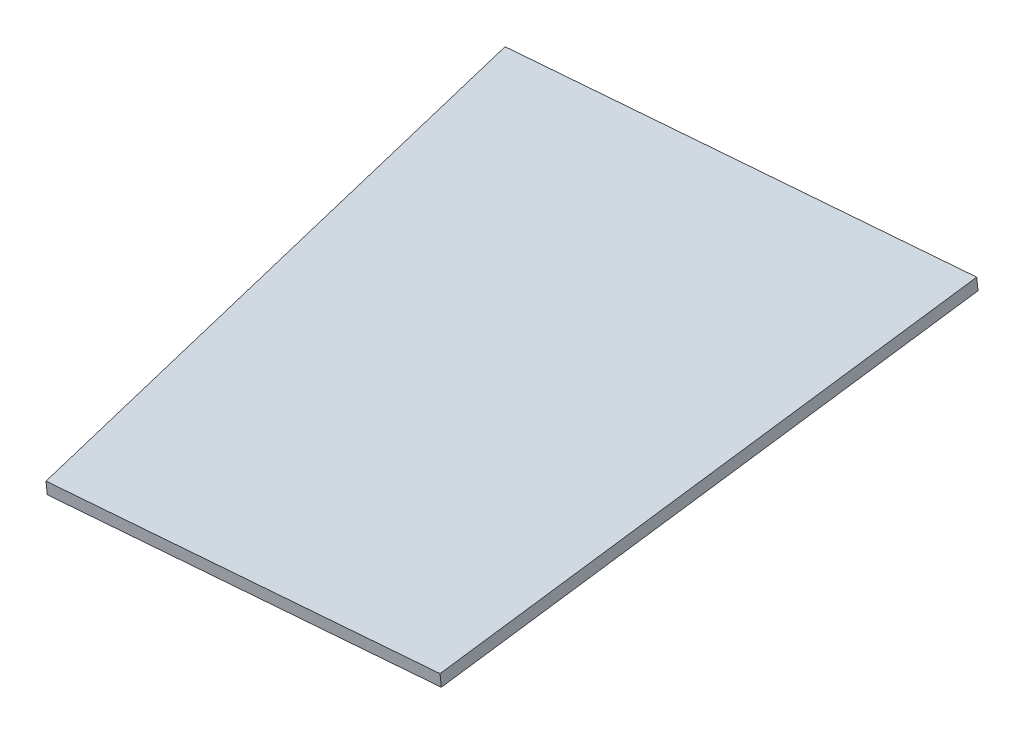
ISO-10303-21;
HEADER;
FILE_DESCRIPTION(('STEP AP214'),'2;1');
FILE_NAME('part.step','',(''),(''),'','','');
FILE_SCHEMA(('AUTOMOTIVE_DESIGN { 1 0 10303 214 1 1 1 1 }'));
ENDSEC;
DATA;
#1=APPLICATION_CONTEXT('core data for automotive mechanical design processes');
#2=APPLICATION_PROTOCOL_DEFINITION('international standard','automotive_design',2000,#1);
#3=PRODUCT_CONTEXT('',#1,'mechanical');
#4=PRODUCT('Part','Part','',(#3));
#5=PRODUCT_RELATED_PRODUCT_CATEGORY('part','',(#4));
#6=PRODUCT_DEFINITION_FORMATION('','',#4);
#7=PRODUCT_DEFINITION_CONTEXT('part definition',#1,'design');
#8=PRODUCT_DEFINITION('design','',#6,#7);
#9=PRODUCT_DEFINITION_SHAPE('','',#8);
#10=(LENGTH_UNIT() NAMED_UNIT(*) SI_UNIT(.MILLI.,.METRE.));
#11=(NAMED_UNIT(*) PLANE_ANGLE_UNIT() SI_UNIT($,.RADIAN.));
#12=(NAMED_UNIT(*) SI_UNIT($,.STERADIAN.) SOLID_ANGLE_UNIT());
#13=UNCERTAINTY_MEASURE_WITH_UNIT(LENGTH_MEASURE(1.E-05),#10,'distance_accuracy_value','');
#14=(GEOMETRIC_REPRESENTATION_CONTEXT(3) GLOBAL_UNCERTAINTY_ASSIGNED_CONTEXT((#13)) GLOBAL_UNIT_ASSIGNED_CONTEXT((#10,
#11,#12)) REPRESENTATION_CONTEXT('',''));
#15=CARTESIAN_POINT('',(0.,0.,0.));
#16=DIRECTION('',(0.,0.,1.));
#17=DIRECTION('',(1.,0.,0.));
#18=AXIS2_PLACEMENT_3D('',#15,#16,#17);
#19=CARTESIAN_POINT('',(-1170.3014032278,132.494811696863,1716.91639450697));
#20=DIRECTION('',(0.988506523153579,0.00360220731095837,-0.151135296292136));
#21=DIRECTION('',(-0.151136276859737,0.,-0.988512936595661));
#22=AXIS2_PLACEMENT_3D('',#19,#20,#21);
#23=PLANE('',#22);
#24=DIRECTION('',(-0.150542908587247,0.115009920737583,-0.981890803911528));
#25=VECTOR('',#24,1.);
#26=CARTESIAN_POINT('',(-1170.12557065827,145.110455906533,1718.36711987123));
#27=LINE('',#26,#25);
#28=CARTESIAN_POINT('',(-1170.12557065827,145.110455906533,1718.36711987123));
#29=VERTEX_POINT('',#28);
#30=CARTESIAN_POINT('',(-1253.07894845788,208.484157764556,1177.31766374471));
#31=VERTEX_POINT('',#30);
#32=EDGE_CURVE('E106',#29,#31,#27,.T.);
#33=ORIENTED_EDGE('',*,*,#32,.T.);
#34=DIRECTION('',(0.0138450842147968,0.993357811785071,0.114230343642402));
#35=VECTOR('',#34,1.);
#36=CARTESIAN_POINT('',(-1253.25478102741,195.868513554886,1175.86693838045));
#37=LINE('',#36,#35);
#38=CARTESIAN_POINT('',(-1253.25478102741,195.868513554886,1175.86693838045));
#39=VERTEX_POINT('',#38);
#40=EDGE_CURVE('E11',#39,#31,#37,.T.);
#41=ORIENTED_EDGE('',*,*,#40,.F.);
#42=DIRECTION('',(-0.150542908587247,0.115009920737583,-0.981890803911528));
#43=VECTOR('',#42,1.);
#44=CARTESIAN_POINT('',(-1170.3014032278,132.494811696863,1716.91639450697));
#45=LINE('',#44,#43);
#46=CARTESIAN_POINT('',(-1170.3014032278,132.494811696863,1716.91639450697));
#47=VERTEX_POINT('',#46);
#48=EDGE_CURVE('E94',#47,#39,#45,.T.);
#49=ORIENTED_EDGE('',*,*,#48,.F.);
#50=DIRECTION('',(0.0138450842147968,0.993357811785071,0.114230343642402));
#51=VECTOR('',#50,1.);
#52=CARTESIAN_POINT('',(-1170.3014032278,132.494811696863,1716.91639450697));
#53=LINE('',#52,#51);
#54=EDGE_CURVE('E102',#47,#29,#53,.T.);
#55=ORIENTED_EDGE('',*,*,#54,.T.);
#56=EDGE_LOOP('',(#33,#41,#49,#55));
#57=FACE_BOUND('',#56,.T.);
#58=ADVANCED_FACE('F43',(#57),#23,.F.);
#59=CARTESIAN_POINT('',(-1253.25478102741,195.868513554886,1175.86693838045));
#60=DIRECTION('',(0.0861413324994515,-0.115001508074473,0.989623324288497));
#61=DIRECTION('',(0.,-0.993315550600652,-0.115430571924959));
#62=AXIS2_PLACEMENT_3D('',#59,#60,#61);
#63=PLANE('',#62);
#64=DIRECTION('',(0.99618672169343,-0.00386146425247455,-0.087161371120025));
#65=VECTOR('',#64,1.);
#66=CARTESIAN_POINT('',(-1253.07894845788,208.484157764556,1177.31766374471));
#67=LINE('',#66,#65);
#68=CARTESIAN_POINT('',(-820.352236068751,206.806802812323,1139.45623400393));
#69=VERTEX_POINT('',#68);
#70=EDGE_CURVE('E98',#31,#69,#67,.T.);
#71=ORIENTED_EDGE('',*,*,#70,.T.);
#72=DIRECTION('',(0.0138450842147968,0.993357811785071,0.114230343642402));
#73=VECTOR('',#72,1.);
#74=CARTESIAN_POINT('',(-820.528068638279,194.191158602652,1138.00550863967));
#75=LINE('',#74,#73);
#76=CARTESIAN_POINT('',(-820.528068638279,194.191158602652,1138.00550863967));
#77=VERTEX_POINT('',#76);
#78=EDGE_CURVE('E51',#77,#69,#75,.T.);
#79=ORIENTED_EDGE('',*,*,#78,.F.);
#80=DIRECTION('',(0.99618672169343,-0.00386146425247455,-0.087161371120025));
#81=VECTOR('',#80,1.);
#82=CARTESIAN_POINT('',(-1253.25478102741,195.868513554886,1175.86693838045));
#83=LINE('',#82,#81);
#84=EDGE_CURVE('E89',#39,#77,#83,.T.);
#85=ORIENTED_EDGE('',*,*,#84,.F.);
#86=ORIENTED_EDGE('',*,*,#40,.T.);
#87=EDGE_LOOP('',(#71,#79,#85,#86));
#88=FACE_BOUND('',#87,.T.);
#89=ADVANCED_FACE('F97',(#88),#63,.F.);
#90=CARTESIAN_POINT('',(-820.528068638279,194.191158602652,1138.00550863967));
#91=DIRECTION('',(-0.999675609103875,0.0113088892651892,0.0228207271221561));
#92=DIRECTION('',(0.0228221865446799,0.,0.999739539980949));
#93=AXIS2_PLACEMENT_3D('',#90,#91,#92);
#94=PLANE('',#93);
#95=DIRECTION('',(0.0213773292504328,-0.114509243247713,0.993192148078585));
#96=VECTOR('',#95,1.);
#97=CARTESIAN_POINT('',(-820.352236068751,206.806802812323,1139.45623400393));
#98=LINE('',#97,#96);
#99=CARTESIAN_POINT('',(-808.572726251256,143.708988336593,1686.73304870304));
#100=VERTEX_POINT('',#99);
#101=EDGE_CURVE('E76',#69,#100,#98,.T.);
#102=ORIENTED_EDGE('',*,*,#101,.T.);
#103=DIRECTION('',(0.0138450842147968,0.993357811785071,0.114230343642402));
#104=VECTOR('',#103,1.);
#105=CARTESIAN_POINT('',(-808.748558820784,131.093344126923,1685.28232333878));
#106=LINE('',#105,#104);
#107=CARTESIAN_POINT('',(-808.748558820784,131.093344126923,1685.28232333878));
#108=VERTEX_POINT('',#107);
#109=EDGE_CURVE('E99',#108,#100,#106,.T.);
#110=ORIENTED_EDGE('',*,*,#109,.F.);
#111=DIRECTION('',(0.0213773292504328,-0.114509243247713,0.993192148078585));
#112=VECTOR('',#111,1.);
#113=CARTESIAN_POINT('',(-820.528068638279,194.191158602652,1138.00550863967));
#114=LINE('',#113,#112);
#115=EDGE_CURVE('E92',#77,#108,#114,.T.);
#116=ORIENTED_EDGE('',*,*,#115,.F.);
#117=ORIENTED_EDGE('',*,*,#78,.T.);
#118=EDGE_LOOP('',(#102,#110,#116,#117));
#119=FACE_BOUND('',#118,.T.);
#120=ADVANCED_FACE('F100',(#119),#94,.F.);
#121=CARTESIAN_POINT('',(-808.748558820784,131.093344126923,1685.28232333878));
#122=DIRECTION('',(-0.0861413324994509,0.115001508074473,-0.989623324288497));
#123=DIRECTION('',(0.,0.993315550600652,0.115430571924959));
#124=AXIS2_PLACEMENT_3D('',#121,#122,#123);
#125=PLANE('',#124);
#126=DIRECTION('',(-0.996186721693431,0.00386146425247463,0.0871613711200245));
#127=VECTOR('',#126,1.);
#128=CARTESIAN_POINT('',(-808.572726251256,143.708988336593,1686.73304870304));
#129=LINE('',#128,#127);
#130=EDGE_CURVE('E82',#100,#29,#129,.T.);
#131=ORIENTED_EDGE('',*,*,#130,.T.);
#132=ORIENTED_EDGE('',*,*,#54,.F.);
#133=DIRECTION('',(-0.996186721693431,0.00386146425247463,0.0871613711200245));
#134=VECTOR('',#133,1.);
#135=CARTESIAN_POINT('',(-808.748558820784,131.093344126923,1685.28232333878));
#136=LINE('',#135,#134);
#137=EDGE_CURVE('E59',#108,#47,#136,.T.);
#138=ORIENTED_EDGE('',*,*,#137,.F.);
#139=ORIENTED_EDGE('',*,*,#109,.T.);
#140=EDGE_LOOP('',(#131,#132,#138,#139));
#141=FACE_BOUND('',#140,.T.);
#142=ADVANCED_FACE('F113',(#141),#125,.F.);
#143=CARTESIAN_POINT('',(4.31323917212442,309.466505169255,35.5868397186834));
#144=DIRECTION('',(-0.0138450842147967,-0.993357811785071,-0.114230343642403));
#145=DIRECTION('',(0.,0.11424129341583,-0.993453032044635));
#146=AXIS2_PLACEMENT_3D('',#143,#144,#145);
#147=PLANE('',#146);
#148=ORIENTED_EDGE('',*,*,#48,.T.);
#149=ORIENTED_EDGE('',*,*,#84,.T.);
#150=ORIENTED_EDGE('',*,*,#115,.T.);
#151=ORIENTED_EDGE('',*,*,#137,.T.);
#152=EDGE_LOOP('',(#148,#149,#150,#151));
#153=FACE_BOUND('',#152,.T.);
#154=ADVANCED_FACE('F90',(#153),#147,.T.);
#155=CARTESIAN_POINT('',(4.48907174165234,322.082149378925,37.0375650829419));
#156=DIRECTION('',(-0.0138450842147967,-0.993357811785071,-0.114230343642403));
#157=DIRECTION('',(0.,0.11424129341583,-0.993453032044635));
#158=AXIS2_PLACEMENT_3D('',#155,#156,#157);
#159=PLANE('',#158);
#160=ORIENTED_EDGE('',*,*,#32,.F.);
#161=ORIENTED_EDGE('',*,*,#130,.F.);
#162=ORIENTED_EDGE('',*,*,#101,.F.);
#163=ORIENTED_EDGE('',*,*,#70,.F.);
#164=EDGE_LOOP('',(#160,#161,#162,#163));
#165=FACE_BOUND('',#164,.T.);
#166=ADVANCED_FACE('F116',(#165),#159,.F.);
#167=CLOSED_SHELL('',(#58,#89,#120,#142,#154,#166));
#168=MANIFOLD_SOLID_BREP('B2',#167);
#169=ADVANCED_BREP_SHAPE_REPRESENTATION('',(#18,#168),#14);
#170=SHAPE_DEFINITION_REPRESENTATION(#9,#169);
ENDSEC;
END-ISO-10303-21;
